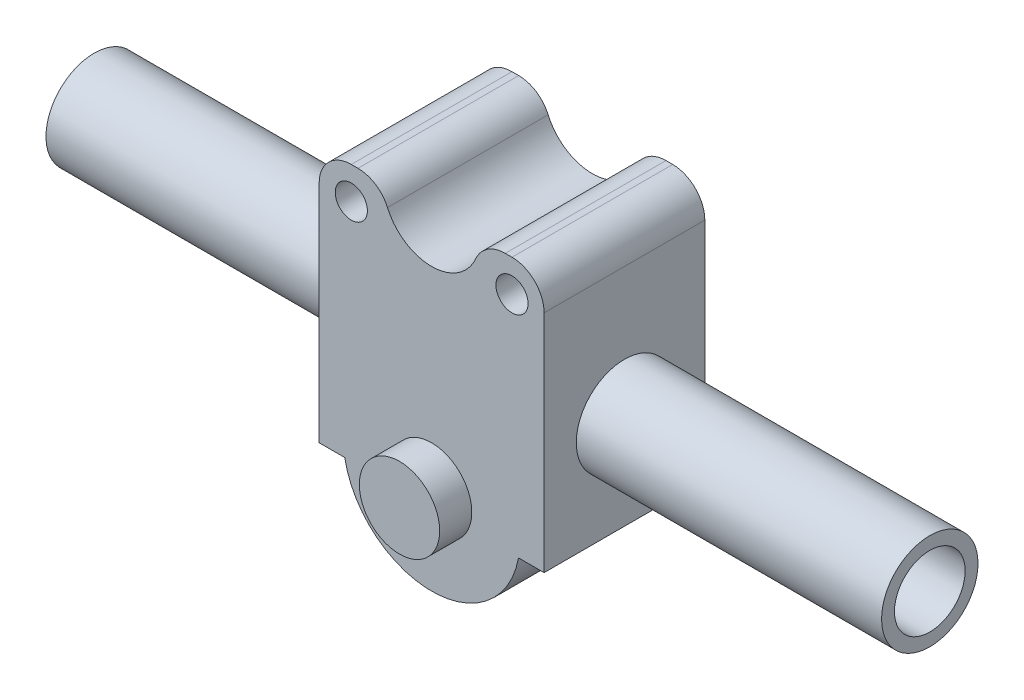
ISO-10303-21;
HEADER;
FILE_DESCRIPTION(('STEP AP214'),'2;1');
FILE_NAME('part.step','',(''),(''),'','','');
FILE_SCHEMA(('AUTOMOTIVE_DESIGN { 1 0 10303 214 1 1 1 1 }'));
ENDSEC;
DATA;
#1=APPLICATION_CONTEXT('core data for automotive mechanical design processes');
#2=APPLICATION_PROTOCOL_DEFINITION('international standard','automotive_design',2000,#1);
#3=PRODUCT_CONTEXT('',#1,'mechanical');
#4=PRODUCT('Part','Part','',(#3));
#5=PRODUCT_RELATED_PRODUCT_CATEGORY('part','',(#4));
#6=PRODUCT_DEFINITION_FORMATION('','',#4);
#7=PRODUCT_DEFINITION_CONTEXT('part definition',#1,'design');
#8=PRODUCT_DEFINITION('design','',#6,#7);
#9=PRODUCT_DEFINITION_SHAPE('','',#8);
#10=(LENGTH_UNIT() NAMED_UNIT(*) SI_UNIT(.MILLI.,.METRE.));
#11=(NAMED_UNIT(*) PLANE_ANGLE_UNIT() SI_UNIT($,.RADIAN.));
#12=(NAMED_UNIT(*) SI_UNIT($,.STERADIAN.) SOLID_ANGLE_UNIT());
#13=UNCERTAINTY_MEASURE_WITH_UNIT(LENGTH_MEASURE(1.E-05),#10,'distance_accuracy_value','');
#14=(GEOMETRIC_REPRESENTATION_CONTEXT(3) GLOBAL_UNCERTAINTY_ASSIGNED_CONTEXT((#13)) GLOBAL_UNIT_ASSIGNED_CONTEXT((#10,
#11,#12)) REPRESENTATION_CONTEXT('',''));
#15=CARTESIAN_POINT('',(0.,0.,0.));
#16=DIRECTION('',(0.,0.,1.));
#17=DIRECTION('',(1.,0.,0.));
#18=AXIS2_PLACEMENT_3D('',#15,#16,#17);
#19=CARTESIAN_POINT('',(0.,0.,55.));
#20=DIRECTION('',(0.,0.,-1.));
#21=DIRECTION('',(-1.,0.,0.));
#22=AXIS2_PLACEMENT_3D('',#19,#20,#21);
#23=CYLINDRICAL_SURFACE('',#22,6.);
#24=CARTESIAN_POINT('',(0.,0.,12.));
#25=DIRECTION('',(0.,0.,1.));
#26=DIRECTION('',(1.,0.,0.));
#27=AXIS2_PLACEMENT_3D('',#24,#25,#26);
#28=CIRCLE('',#27,6.);
#29=CARTESIAN_POINT('',(6.,0.,12.));
#30=VERTEX_POINT('',#29);
#31=EDGE_CURVE('E805',#30,#30,#28,.T.);
#32=ORIENTED_EDGE('',*,*,#31,.F.);
#33=EDGE_LOOP('',(#32));
#34=FACE_BOUND('',#33,.T.);
#35=CARTESIAN_POINT('',(0.,0.,50.));
#36=DIRECTION('',(0.,0.,1.));
#37=DIRECTION('',(1.,0.,0.));
#38=AXIS2_PLACEMENT_3D('',#35,#36,#37);
#39=CIRCLE('',#38,6.);
#40=CARTESIAN_POINT('',(6.,0.,50.));
#41=VERTEX_POINT('',#40);
#42=EDGE_CURVE('E43',#41,#41,#39,.T.);
#43=ORIENTED_EDGE('',*,*,#42,.T.);
#44=EDGE_LOOP('',(#43));
#45=FACE_BOUND('',#44,.T.);
#46=ADVANCED_FACE('F39',(#34,#45),#23,.F.);
#47=CARTESIAN_POINT('',(25.,65.,45.));
#48=DIRECTION('',(0.,0.,-1.));
#49=DIRECTION('',(-1.,0.,0.));
#50=AXIS2_PLACEMENT_3D('',#47,#48,#49);
#51=PLANE('',#50);
#52=CARTESIAN_POINT('',(0.,0.,45.));
#53=DIRECTION('',(0.,0.,-1.));
#54=DIRECTION('',(-1.,0.,0.));
#55=AXIS2_PLACEMENT_3D('',#52,#53,#54);
#56=CIRCLE('',#55,12.5);
#57=CARTESIAN_POINT('',(-12.5,0.,45.));
#58=VERTEX_POINT('',#57);
#59=EDGE_CURVE('E11',#58,#58,#56,.T.);
#60=ORIENTED_EDGE('',*,*,#59,.F.);
#61=EDGE_LOOP('',(#60));
#62=FACE_BOUND('',#61,.T.);
#63=CARTESIAN_POINT('',(0.,75.,45.));
#64=DIRECTION('',(0.,0.,-1.));
#65=DIRECTION('',(-1.,0.,0.));
#66=AXIS2_PLACEMENT_3D('',#63,#64,#65);
#67=CIRCLE('',#66,20.);
#68=CARTESIAN_POINT('',(15.3915936973581,62.2289842433953,45.));
#69=VERTEX_POINT('',#68);
#70=CARTESIAN_POINT('',(-15.3915936973581,62.2289842433953,45.));
#71=VERTEX_POINT('',#70);
#72=EDGE_CURVE('E304',#69,#71,#67,.T.);
#73=ORIENTED_EDGE('',*,*,#72,.F.);
#74=CARTESIAN_POINT('',(25.,65.,45.));
#75=DIRECTION('',(0.,0.,-1.));
#76=DIRECTION('',(-1.,0.,0.));
#77=AXIS2_PLACEMENT_3D('',#74,#75,#76);
#78=CIRCLE('',#77,10.);
#79=CARTESIAN_POINT('',(30.,56.3397459621556,45.));
#80=VERTEX_POINT('',#79);
#81=EDGE_CURVE('E314',#69,#80,#78,.F.);
#82=ORIENTED_EDGE('',*,*,#81,.T.);
#83=DIRECTION('',(0.,1.,0.));
#84=VECTOR('',#83,1.);
#85=CARTESIAN_POINT('',(30.,65.,45.));
#86=LINE('',#85,#84);
#87=CARTESIAN_POINT('',(30.,0.,45.));
#88=VERTEX_POINT('',#87);
#89=EDGE_CURVE('E366',#88,#80,#86,.T.);
#90=ORIENTED_EDGE('',*,*,#89,.F.);
#91=DIRECTION('',(1.,0.,0.));
#92=VECTOR('',#91,1.);
#93=CARTESIAN_POINT('',(25.,0.,45.));
#94=LINE('',#93,#92);
#95=CARTESIAN_POINT('',(22.5,0.,45.));
#96=VERTEX_POINT('',#95);
#97=EDGE_CURVE('E370',#96,#88,#94,.T.);
#98=ORIENTED_EDGE('',*,*,#97,.F.);
#99=CARTESIAN_POINT('',(0.,0.,45.));
#100=DIRECTION('',(0.,0.,-1.));
#101=DIRECTION('',(-1.,0.,0.));
#102=AXIS2_PLACEMENT_3D('',#99,#100,#101);
#103=CIRCLE('',#102,22.5);
#104=CARTESIAN_POINT('',(-22.5,0.,45.));
#105=VERTEX_POINT('',#104);
#106=EDGE_CURVE('E374',#105,#96,#103,.F.);
#107=ORIENTED_EDGE('',*,*,#106,.F.);
#108=DIRECTION('',(1.,0.,0.));
#109=VECTOR('',#108,1.);
#110=CARTESIAN_POINT('',(25.,0.,45.));
#111=LINE('',#110,#109);
#112=CARTESIAN_POINT('',(-30.,0.,45.));
#113=VERTEX_POINT('',#112);
#114=EDGE_CURVE('E107',#113,#105,#111,.T.);
#115=ORIENTED_EDGE('',*,*,#114,.F.);
#116=DIRECTION('',(0.,-1.,0.));
#117=VECTOR('',#116,1.);
#118=CARTESIAN_POINT('',(-30.,65.,45.));
#119=LINE('',#118,#117);
#120=CARTESIAN_POINT('',(-30.,56.3397459621556,45.));
#121=VERTEX_POINT('',#120);
#122=EDGE_CURVE('E114',#121,#113,#119,.T.);
#123=ORIENTED_EDGE('',*,*,#122,.F.);
#124=CARTESIAN_POINT('',(-25.,65.,45.));
#125=DIRECTION('',(0.,0.,-1.));
#126=DIRECTION('',(-1.,0.,0.));
#127=AXIS2_PLACEMENT_3D('',#124,#125,#126);
#128=CIRCLE('',#127,10.);
#129=EDGE_CURVE('E307',#121,#71,#128,.F.);
#130=ORIENTED_EDGE('',*,*,#129,.T.);
#131=EDGE_LOOP('',(#73,#82,#90,#98,#107,#115,#123,#130));
#132=FACE_BOUND('',#131,.T.);
#133=ADVANCED_FACE('F412',(#62,#132),#51,.T.);
#134=CARTESIAN_POINT('',(25.,65.,5.));
#135=DIRECTION('',(0.,0.,-1.));
#136=DIRECTION('',(-1.,0.,0.));
#137=AXIS2_PLACEMENT_3D('',#134,#135,#136);
#138=PLANE('',#137);
#139=CARTESIAN_POINT('',(0.,0.,5.));
#140=DIRECTION('',(0.,0.,-1.));
#141=DIRECTION('',(-1.,0.,0.));
#142=AXIS2_PLACEMENT_3D('',#139,#140,#141);
#143=CIRCLE('',#142,15.);
#144=CARTESIAN_POINT('',(-15.,0.,5.));
#145=VERTEX_POINT('',#144);
#146=EDGE_CURVE('E857',#145,#145,#143,.T.);
#147=ORIENTED_EDGE('',*,*,#146,.T.);
#148=EDGE_LOOP('',(#147));
#149=FACE_BOUND('',#148,.T.);
#150=CARTESIAN_POINT('',(-25.,65.,5.));
#151=DIRECTION('',(0.,0.,-1.));
#152=DIRECTION('',(-1.,0.,0.));
#153=AXIS2_PLACEMENT_3D('',#150,#151,#152);
#154=CIRCLE('',#153,10.);
#155=CARTESIAN_POINT('',(-30.,56.3397459621556,5.));
#156=VERTEX_POINT('',#155);
#157=CARTESIAN_POINT('',(-15.3915936973581,62.2289842433953,5.));
#158=VERTEX_POINT('',#157);
#159=EDGE_CURVE('E362',#156,#158,#154,.F.);
#160=ORIENTED_EDGE('',*,*,#159,.F.);
#161=DIRECTION('',(0.,-1.,0.));
#162=VECTOR('',#161,1.);
#163=CARTESIAN_POINT('',(-30.,65.,5.));
#164=LINE('',#163,#162);
#165=CARTESIAN_POINT('',(-30.,0.,5.));
#166=VERTEX_POINT('',#165);
#167=EDGE_CURVE('E330',#156,#166,#164,.T.);
#168=ORIENTED_EDGE('',*,*,#167,.T.);
#169=DIRECTION('',(1.,0.,0.));
#170=VECTOR('',#169,1.);
#171=CARTESIAN_POINT('',(25.,0.,5.));
#172=LINE('',#171,#170);
#173=CARTESIAN_POINT('',(-22.5,0.,5.));
#174=VERTEX_POINT('',#173);
#175=EDGE_CURVE('E327',#166,#174,#172,.T.);
#176=ORIENTED_EDGE('',*,*,#175,.T.);
#177=CARTESIAN_POINT('',(0.,0.,5.));
#178=DIRECTION('',(0.,0.,-1.));
#179=DIRECTION('',(-1.,0.,0.));
#180=AXIS2_PLACEMENT_3D('',#177,#178,#179);
#181=CIRCLE('',#180,22.5);
#182=CARTESIAN_POINT('',(22.5,0.,5.));
#183=VERTEX_POINT('',#182);
#184=EDGE_CURVE('E321',#174,#183,#181,.F.);
#185=ORIENTED_EDGE('',*,*,#184,.T.);
#186=DIRECTION('',(1.,0.,0.));
#187=VECTOR('',#186,1.);
#188=CARTESIAN_POINT('',(25.,0.,5.));
#189=LINE('',#188,#187);
#190=CARTESIAN_POINT('',(30.,0.,5.));
#191=VERTEX_POINT('',#190);
#192=EDGE_CURVE('E354',#183,#191,#189,.T.);
#193=ORIENTED_EDGE('',*,*,#192,.T.);
#194=DIRECTION('',(0.,1.,0.));
#195=VECTOR('',#194,1.);
#196=CARTESIAN_POINT('',(30.,65.,5.));
#197=LINE('',#196,#195);
#198=CARTESIAN_POINT('',(30.,56.3397459621556,5.));
#199=VERTEX_POINT('',#198);
#200=EDGE_CURVE('E342',#191,#199,#197,.T.);
#201=ORIENTED_EDGE('',*,*,#200,.T.);
#202=CARTESIAN_POINT('',(25.,65.,5.));
#203=DIRECTION('',(0.,0.,-1.));
#204=DIRECTION('',(-1.,0.,0.));
#205=AXIS2_PLACEMENT_3D('',#202,#203,#204);
#206=CIRCLE('',#205,10.);
#207=CARTESIAN_POINT('',(15.3915936973581,62.2289842433953,5.));
#208=VERTEX_POINT('',#207);
#209=EDGE_CURVE('E358',#208,#199,#206,.F.);
#210=ORIENTED_EDGE('',*,*,#209,.F.);
#211=CARTESIAN_POINT('',(0.,75.,5.));
#212=DIRECTION('',(0.,0.,-1.));
#213=DIRECTION('',(-1.,0.,0.));
#214=AXIS2_PLACEMENT_3D('',#211,#212,#213);
#215=CIRCLE('',#214,20.);
#216=EDGE_CURVE('E336',#208,#158,#215,.T.);
#217=ORIENTED_EDGE('',*,*,#216,.T.);
#218=EDGE_LOOP('',(#160,#168,#176,#185,#193,#201,#210,#217));
#219=FACE_BOUND('',#218,.T.);
#220=ADVANCED_FACE('F419',(#149,#219),#138,.F.);
#221=CARTESIAN_POINT('',(27.0416345659799,0.,50.));
#222=DIRECTION('',(0.,1.,0.));
#223=DIRECTION('',(0.,0.,1.));
#224=AXIS2_PLACEMENT_3D('',#221,#222,#223);
#225=PLANE('',#224);
#226=ORIENTED_EDGE('',*,*,#192,.F.);
#227=DIRECTION('',(0.,0.,-1.));
#228=VECTOR('',#227,1.);
#229=CARTESIAN_POINT('',(22.5,0.,45.));
#230=LINE('',#229,#228);
#231=EDGE_CURVE('E350',#96,#183,#230,.T.);
#232=ORIENTED_EDGE('',*,*,#231,.F.);
#233=ORIENTED_EDGE('',*,*,#97,.T.);
#234=DIRECTION('',(0.,0.,-1.));
#235=VECTOR('',#234,1.);
#236=CARTESIAN_POINT('',(30.,0.,50.));
#237=LINE('',#236,#235);
#238=EDGE_CURVE('E346',#88,#191,#237,.T.);
#239=ORIENTED_EDGE('',*,*,#238,.T.);
#240=EDGE_LOOP('',(#226,#232,#233,#239));
#241=FACE_BOUND('',#240,.T.);
#242=ADVANCED_FACE('F571',(#241),#225,.T.);
#243=CARTESIAN_POINT('',(30.,64.9999999999999,50.));
#244=DIRECTION('',(-1.,0.,0.));
#245=DIRECTION('',(0.,-1.,0.));
#246=AXIS2_PLACEMENT_3D('',#243,#244,#245);
#247=PLANE('',#246);
#248=CARTESIAN_POINT('',(30.,25.,25.));
#249=DIRECTION('',(-1.,0.,0.));
#250=DIRECTION('',(0.,-1.,0.));
#251=AXIS2_PLACEMENT_3D('',#248,#249,#250);
#252=CIRCLE('',#251,11.);
#253=CARTESIAN_POINT('',(30.,14.,25.));
#254=VERTEX_POINT('',#253);
#255=EDGE_CURVE('E830',#254,#254,#252,.T.);
#256=ORIENTED_EDGE('',*,*,#255,.F.);
#257=EDGE_LOOP('',(#256));
#258=FACE_BOUND('',#257,.T.);
#259=DIRECTION('',(0.,0.,-1.));
#260=VECTOR('',#259,1.);
#261=CARTESIAN_POINT('',(30.,56.3397459621556,50.));
#262=LINE('',#261,#260);
#263=EDGE_CURVE('E311',#80,#199,#262,.T.);
#264=ORIENTED_EDGE('',*,*,#263,.T.);
#265=ORIENTED_EDGE('',*,*,#200,.F.);
#266=ORIENTED_EDGE('',*,*,#238,.F.);
#267=ORIENTED_EDGE('',*,*,#89,.T.);
#268=EDGE_LOOP('',(#264,#265,#266,#267));
#269=FACE_BOUND('',#268,.T.);
#270=ADVANCED_FACE('F575',(#258,#269),#247,.T.);
#271=CARTESIAN_POINT('',(0.,75.,50.));
#272=DIRECTION('',(0.,0.,-1.));
#273=DIRECTION('',(-1.,0.,0.));
#274=AXIS2_PLACEMENT_3D('',#271,#272,#273);
#275=CYLINDRICAL_SURFACE('',#274,20.);
#276=ORIENTED_EDGE('',*,*,#72,.T.);
#277=DIRECTION('',(0.,0.,1.));
#278=VECTOR('',#277,1.);
#279=CARTESIAN_POINT('',(-15.3915936973581,62.2289842433953,50.));
#280=LINE('',#279,#278);
#281=EDGE_CURVE('E59',#71,#158,#280,.F.);
#282=ORIENTED_EDGE('',*,*,#281,.T.);
#283=ORIENTED_EDGE('',*,*,#216,.F.);
#284=DIRECTION('',(0.,0.,1.));
#285=VECTOR('',#284,1.);
#286=CARTESIAN_POINT('',(15.3915936973581,62.2289842433953,50.));
#287=LINE('',#286,#285);
#288=EDGE_CURVE('E339',#69,#208,#287,.F.);
#289=ORIENTED_EDGE('',*,*,#288,.F.);
#290=EDGE_LOOP('',(#276,#282,#283,#289));
#291=FACE_BOUND('',#290,.T.);
#292=ADVANCED_FACE('F579',(#291),#275,.T.);
#293=CARTESIAN_POINT('',(-30.,64.9999999999999,50.));
#294=DIRECTION('',(1.,0.,0.));
#295=DIRECTION('',(0.,1.,0.));
#296=AXIS2_PLACEMENT_3D('',#293,#294,#295);
#297=PLANE('',#296);
#298=CARTESIAN_POINT('',(-30.,25.,25.));
#299=DIRECTION('',(1.,0.,0.));
#300=DIRECTION('',(0.,1.,0.));
#301=AXIS2_PLACEMENT_3D('',#298,#299,#300);
#302=CIRCLE('',#301,11.);
#303=CARTESIAN_POINT('',(-30.,36.,25.));
#304=VERTEX_POINT('',#303);
#305=EDGE_CURVE('E823',#304,#304,#302,.T.);
#306=ORIENTED_EDGE('',*,*,#305,.F.);
#307=EDGE_LOOP('',(#306));
#308=FACE_BOUND('',#307,.T.);
#309=ORIENTED_EDGE('',*,*,#122,.T.);
#310=DIRECTION('',(0.,0.,-1.));
#311=VECTOR('',#310,1.);
#312=CARTESIAN_POINT('',(-30.,0.,50.));
#313=LINE('',#312,#311);
#314=EDGE_CURVE('E324',#113,#166,#313,.T.);
#315=ORIENTED_EDGE('',*,*,#314,.T.);
#316=ORIENTED_EDGE('',*,*,#167,.F.);
#317=DIRECTION('',(0.,0.,-1.));
#318=VECTOR('',#317,1.);
#319=CARTESIAN_POINT('',(-30.,56.3397459621556,50.));
#320=LINE('',#319,#318);
#321=EDGE_CURVE('E333',#121,#156,#320,.T.);
#322=ORIENTED_EDGE('',*,*,#321,.F.);
#323=EDGE_LOOP('',(#309,#315,#316,#322));
#324=FACE_BOUND('',#323,.T.);
#325=ADVANCED_FACE('F583',(#308,#324),#297,.T.);
#326=CARTESIAN_POINT('',(-35.,0.,50.));
#327=DIRECTION('',(0.,1.,0.));
#328=DIRECTION('',(0.,0.,1.));
#329=AXIS2_PLACEMENT_3D('',#326,#327,#328);
#330=PLANE('',#329);
#331=ORIENTED_EDGE('',*,*,#175,.F.);
#332=ORIENTED_EDGE('',*,*,#314,.F.);
#333=ORIENTED_EDGE('',*,*,#114,.T.);
#334=DIRECTION('',(0.,0.,-1.));
#335=VECTOR('',#334,1.);
#336=CARTESIAN_POINT('',(-22.5,0.,45.));
#337=LINE('',#336,#335);
#338=EDGE_CURVE('E318',#105,#174,#337,.T.);
#339=ORIENTED_EDGE('',*,*,#338,.T.);
#340=EDGE_LOOP('',(#331,#332,#333,#339));
#341=FACE_BOUND('',#340,.T.);
#342=ADVANCED_FACE('F586',(#341),#330,.T.);
#343=CARTESIAN_POINT('',(0.,0.,50.));
#344=DIRECTION('',(0.,0.,-1.));
#345=DIRECTION('',(-1.,0.,0.));
#346=AXIS2_PLACEMENT_3D('',#343,#344,#345);
#347=CYLINDRICAL_SURFACE('',#346,22.5);
#348=ORIENTED_EDGE('',*,*,#184,.F.);
#349=ORIENTED_EDGE('',*,*,#338,.F.);
#350=ORIENTED_EDGE('',*,*,#106,.T.);
#351=ORIENTED_EDGE('',*,*,#231,.T.);
#352=EDGE_LOOP('',(#348,#349,#350,#351));
#353=FACE_BOUND('',#352,.T.);
#354=ADVANCED_FACE('F590',(#353),#347,.F.);
#355=CARTESIAN_POINT('',(25.,65.,50.));
#356=DIRECTION('',(0.,0.,-1.));
#357=DIRECTION('',(-1.,0.,0.));
#358=AXIS2_PLACEMENT_3D('',#355,#356,#357);
#359=CYLINDRICAL_SURFACE('',#358,10.);
#360=ORIENTED_EDGE('',*,*,#81,.F.);
#361=ORIENTED_EDGE('',*,*,#288,.T.);
#362=ORIENTED_EDGE('',*,*,#209,.T.);
#363=ORIENTED_EDGE('',*,*,#263,.F.);
#364=EDGE_LOOP('',(#360,#361,#362,#363));
#365=FACE_BOUND('',#364,.T.);
#366=ADVANCED_FACE('F592',(#365),#359,.T.);
#367=CARTESIAN_POINT('',(-25.,65.,50.));
#368=DIRECTION('',(0.,0.,-1.));
#369=DIRECTION('',(-1.,0.,0.));
#370=AXIS2_PLACEMENT_3D('',#367,#368,#369);
#371=CYLINDRICAL_SURFACE('',#370,10.);
#372=ORIENTED_EDGE('',*,*,#321,.T.);
#373=ORIENTED_EDGE('',*,*,#159,.T.);
#374=ORIENTED_EDGE('',*,*,#281,.F.);
#375=ORIENTED_EDGE('',*,*,#129,.F.);
#376=EDGE_LOOP('',(#372,#373,#374,#375));
#377=FACE_BOUND('',#376,.T.);
#378=ADVANCED_FACE('F41',(#377),#371,.T.);
#379=CARTESIAN_POINT('',(0.,0.,5.));
#380=DIRECTION('',(0.,0.,-1.));
#381=DIRECTION('',(-1.,0.,0.));
#382=AXIS2_PLACEMENT_3D('',#379,#380,#381);
#383=CYLINDRICAL_SURFACE('',#382,15.);
#384=ORIENTED_EDGE('',*,*,#146,.F.);
#385=EDGE_LOOP('',(#384));
#386=FACE_BOUND('',#385,.T.);
#387=CARTESIAN_POINT('',(0.,0.,0.));
#388=DIRECTION('',(0.,0.,-1.));
#389=DIRECTION('',(-1.,0.,0.));
#390=AXIS2_PLACEMENT_3D('',#387,#388,#389);
#391=CIRCLE('',#390,15.);
#392=CARTESIAN_POINT('',(-15.,0.,0.));
#393=VERTEX_POINT('',#392);
#394=EDGE_CURVE('E854',#393,#393,#391,.T.);
#395=ORIENTED_EDGE('',*,*,#394,.T.);
#396=EDGE_LOOP('',(#395));
#397=FACE_BOUND('',#396,.T.);
#398=ADVANCED_FACE('F456',(#386,#397),#383,.F.);
#399=CARTESIAN_POINT('',(0.,0.,-10.));
#400=DIRECTION('',(0.,0.,-1.));
#401=DIRECTION('',(-1.,0.,0.));
#402=AXIS2_PLACEMENT_3D('',#399,#400,#401);
#403=PLANE('',#402);
#404=CARTESIAN_POINT('',(0.,0.,-10.));
#405=DIRECTION('',(0.,0.,-1.));
#406=DIRECTION('',(-1.,0.,0.));
#407=AXIS2_PLACEMENT_3D('',#404,#405,#406);
#408=CIRCLE('',#407,27.5);
#409=CARTESIAN_POINT('',(-27.5,0.,-10.));
#410=VERTEX_POINT('',#409);
#411=EDGE_CURVE('E847',#410,#410,#408,.T.);
#412=ORIENTED_EDGE('',*,*,#411,.T.);
#413=EDGE_LOOP('',(#412));
#414=FACE_BOUND('',#413,.T.);
#415=CARTESIAN_POINT('',(0.,0.,-10.));
#416=DIRECTION('',(0.,0.,-1.));
#417=DIRECTION('',(-1.,0.,0.));
#418=AXIS2_PLACEMENT_3D('',#415,#416,#417);
#419=CIRCLE('',#418,6.);
#420=CARTESIAN_POINT('',(-6.,0.,-10.));
#421=VERTEX_POINT('',#420);
#422=EDGE_CURVE('E843',#421,#421,#419,.T.);
#423=ORIENTED_EDGE('',*,*,#422,.F.);
#424=EDGE_LOOP('',(#423));
#425=FACE_BOUND('',#424,.T.);
#426=ADVANCED_FACE('F453',(#414,#425),#403,.T.);
#427=CARTESIAN_POINT('',(0.,0.,0.));
#428=DIRECTION('',(0.,0.,-1.));
#429=DIRECTION('',(-1.,0.,0.));
#430=AXIS2_PLACEMENT_3D('',#427,#428,#429);
#431=PLANE('',#430);
#432=ORIENTED_EDGE('',*,*,#394,.F.);
#433=EDGE_LOOP('',(#432));
#434=FACE_BOUND('',#433,.T.);
#435=CARTESIAN_POINT('',(0.,0.,0.));
#436=DIRECTION('',(0.,0.,-1.));
#437=DIRECTION('',(-1.,0.,0.));
#438=AXIS2_PLACEMENT_3D('',#435,#436,#437);
#439=CIRCLE('',#438,6.);
#440=CARTESIAN_POINT('',(-6.,0.,0.));
#441=VERTEX_POINT('',#440);
#442=EDGE_CURVE('E842',#441,#441,#439,.T.);
#443=ORIENTED_EDGE('',*,*,#442,.T.);
#444=EDGE_LOOP('',(#443));
#445=FACE_BOUND('',#444,.T.);
#446=ADVANCED_FACE('F406',(#434,#445),#431,.F.);
#447=CARTESIAN_POINT('',(0.,0.,-10.));
#448=DIRECTION('',(0.,0.,1.));
#449=DIRECTION('',(1.,0.,0.));
#450=AXIS2_PLACEMENT_3D('',#447,#448,#449);
#451=CYLINDRICAL_SURFACE('',#450,6.);
#452=ORIENTED_EDGE('',*,*,#422,.T.);
#453=EDGE_LOOP('',(#452));
#454=FACE_BOUND('',#453,.T.);
#455=ORIENTED_EDGE('',*,*,#442,.F.);
#456=EDGE_LOOP('',(#455));
#457=FACE_BOUND('',#456,.T.);
#458=ADVANCED_FACE('F395',(#454,#457),#451,.F.);
#459=CARTESIAN_POINT('',(25.,65.,50.));
#460=DIRECTION('',(0.,0.,-1.));
#461=DIRECTION('',(-1.,0.,0.));
#462=AXIS2_PLACEMENT_3D('',#459,#460,#461);
#463=PLANE('',#462);
#464=CARTESIAN_POINT('',(0.,0.,50.));
#465=DIRECTION('',(0.,0.,-1.));
#466=DIRECTION('',(-1.,0.,0.));
#467=AXIS2_PLACEMENT_3D('',#464,#465,#466);
#468=CIRCLE('',#467,12.5);
#469=CARTESIAN_POINT('',(-12.5,0.,50.));
#470=VERTEX_POINT('',#469);
#471=EDGE_CURVE('E50',#470,#470,#468,.F.);
#472=ORIENTED_EDGE('',*,*,#471,.F.);
#473=EDGE_LOOP('',(#472));
#474=FACE_BOUND('',#473,.T.);
#475=DIRECTION('',(1.,0.,0.));
#476=VECTOR('',#475,1.);
#477=CARTESIAN_POINT('',(27.0416345659799,-5.,50.));
#478=LINE('',#477,#476);
#479=CARTESIAN_POINT('',(27.0416345659799,-5.,50.));
#480=VERTEX_POINT('',#479);
#481=CARTESIAN_POINT('',(35.,-5.,50.));
#482=VERTEX_POINT('',#481);
#483=EDGE_CURVE('E265',#480,#482,#478,.T.);
#484=ORIENTED_EDGE('',*,*,#483,.T.);
#485=DIRECTION('',(0.,1.,0.));
#486=VECTOR('',#485,1.);
#487=CARTESIAN_POINT('',(35.,64.9999999999999,50.));
#488=LINE('',#487,#486);
#489=CARTESIAN_POINT('',(35.,64.9999999999999,50.));
#490=VERTEX_POINT('',#489);
#491=EDGE_CURVE('E178',#482,#490,#488,.T.);
#492=ORIENTED_EDGE('',*,*,#491,.T.);
#493=CARTESIAN_POINT('',(25.,65.,50.));
#494=DIRECTION('',(0.,0.,1.));
#495=DIRECTION('',(-1.,0.,0.));
#496=AXIS2_PLACEMENT_3D('',#493,#494,#495);
#497=CIRCLE('',#496,10.);
#498=CARTESIAN_POINT('',(24.9999999999999,75.,50.));
#499=VERTEX_POINT('',#498);
#500=EDGE_CURVE('E494',#490,#499,#497,.T.);
#501=ORIENTED_EDGE('',*,*,#500,.T.);
#502=DIRECTION('',(-1.,0.,0.));
#503=VECTOR('',#502,1.);
#504=CARTESIAN_POINT('',(22.9128784747792,75.,50.));
#505=LINE('',#504,#503);
#506=CARTESIAN_POINT('',(22.9128784747792,75.,50.));
#507=VERTEX_POINT('',#506);
#508=EDGE_CURVE('E497',#499,#507,#505,.T.);
#509=ORIENTED_EDGE('',*,*,#508,.T.);
#510=CARTESIAN_POINT('',(22.9128784747792,65.,50.));
#511=DIRECTION('',(0.,0.,1.));
#512=DIRECTION('',(-1.,0.,0.));
#513=AXIS2_PLACEMENT_3D('',#510,#511,#512);
#514=CIRCLE('',#513,10.);
#515=CARTESIAN_POINT('',(13.7477270848675,69.,50.));
#516=VERTEX_POINT('',#515);
#517=EDGE_CURVE('E500',#507,#516,#514,.T.);
#518=ORIENTED_EDGE('',*,*,#517,.T.);
#519=CARTESIAN_POINT('',(0.,75.,50.));
#520=DIRECTION('',(0.,0.,-1.));
#521=DIRECTION('',(1.,0.,0.));
#522=AXIS2_PLACEMENT_3D('',#519,#520,#521);
#523=CIRCLE('',#522,15.);
#524=CARTESIAN_POINT('',(-13.7477270848675,69.,50.));
#525=VERTEX_POINT('',#524);
#526=EDGE_CURVE('E503',#516,#525,#523,.T.);
#527=ORIENTED_EDGE('',*,*,#526,.T.);
#528=CARTESIAN_POINT('',(-22.9128784747792,65.,50.));
#529=DIRECTION('',(0.,0.,1.));
#530=DIRECTION('',(1.,0.,0.));
#531=AXIS2_PLACEMENT_3D('',#528,#529,#530);
#532=CIRCLE('',#531,10.);
#533=CARTESIAN_POINT('',(-22.9128784747792,75.,50.));
#534=VERTEX_POINT('',#533);
#535=EDGE_CURVE('E506',#525,#534,#532,.T.);
#536=ORIENTED_EDGE('',*,*,#535,.T.);
#537=DIRECTION('',(-1.,0.,0.));
#538=VECTOR('',#537,1.);
#539=CARTESIAN_POINT('',(-24.9999999999999,75.,50.));
#540=LINE('',#539,#538);
#541=CARTESIAN_POINT('',(-24.9999999999999,75.,50.));
#542=VERTEX_POINT('',#541);
#543=EDGE_CURVE('E509',#534,#542,#540,.T.);
#544=ORIENTED_EDGE('',*,*,#543,.T.);
#545=CARTESIAN_POINT('',(-25.,65.,50.));
#546=DIRECTION('',(0.,0.,1.));
#547=DIRECTION('',(1.,0.,0.));
#548=AXIS2_PLACEMENT_3D('',#545,#546,#547);
#549=CIRCLE('',#548,10.);
#550=CARTESIAN_POINT('',(-35.,64.9999999999999,50.));
#551=VERTEX_POINT('',#550);
#552=EDGE_CURVE('E211',#542,#551,#549,.T.);
#553=ORIENTED_EDGE('',*,*,#552,.T.);
#554=DIRECTION('',(0.,-1.,0.));
#555=VECTOR('',#554,1.);
#556=CARTESIAN_POINT('',(-35.,64.9999999999999,50.));
#557=LINE('',#556,#555);
#558=CARTESIAN_POINT('',(-35.,-5.,50.));
#559=VERTEX_POINT('',#558);
#560=EDGE_CURVE('E204',#551,#559,#557,.T.);
#561=ORIENTED_EDGE('',*,*,#560,.T.);
#562=DIRECTION('',(1.,0.,0.));
#563=VECTOR('',#562,1.);
#564=CARTESIAN_POINT('',(-35.,-5.,50.));
#565=LINE('',#564,#563);
#566=CARTESIAN_POINT('',(-27.0416345659799,-5.,50.));
#567=VERTEX_POINT('',#566);
#568=EDGE_CURVE('E208',#559,#567,#565,.T.);
#569=ORIENTED_EDGE('',*,*,#568,.T.);
#570=CARTESIAN_POINT('',(0.,0.,50.));
#571=DIRECTION('',(0.,0.,1.));
#572=DIRECTION('',(1.,0.,0.));
#573=AXIS2_PLACEMENT_3D('',#570,#571,#572);
#574=CIRCLE('',#573,27.5);
#575=EDGE_CURVE('E122',#567,#480,#574,.T.);
#576=ORIENTED_EDGE('',*,*,#575,.T.);
#577=EDGE_LOOP('',(#484,#492,#501,#509,#518,#527,#536,#544,#553,#561,#569,#576));
#578=FACE_BOUND('',#577,.T.);
#579=CARTESIAN_POINT('',(25.,65.,50.));
#580=DIRECTION('',(0.,0.,1.));
#581=DIRECTION('',(1.,0.,0.));
#582=AXIS2_PLACEMENT_3D('',#579,#580,#581);
#583=CIRCLE('',#582,5.);
#584=CARTESIAN_POINT('',(30.,65.,50.));
#585=VERTEX_POINT('',#584);
#586=EDGE_CURVE('E236',#585,#585,#583,.T.);
#587=ORIENTED_EDGE('',*,*,#586,.F.);
#588=EDGE_LOOP('',(#587));
#589=FACE_BOUND('',#588,.T.);
#590=CARTESIAN_POINT('',(-25.,65.,50.));
#591=DIRECTION('',(0.,0.,1.));
#592=DIRECTION('',(1.,0.,0.));
#593=AXIS2_PLACEMENT_3D('',#590,#591,#592);
#594=CIRCLE('',#593,5.);
#595=CARTESIAN_POINT('',(-20.,65.,50.));
#596=VERTEX_POINT('',#595);
#597=EDGE_CURVE('E480',#596,#596,#594,.T.);
#598=ORIENTED_EDGE('',*,*,#597,.F.);
#599=EDGE_LOOP('',(#598));
#600=FACE_BOUND('',#599,.T.);
#601=ADVANCED_FACE('F205',(#474,#578,#589,#600),#463,.F.);
#602=CARTESIAN_POINT('',(-25.,65.,50.));
#603=DIRECTION('',(0.,0.,-1.));
#604=DIRECTION('',(-1.,0.,0.));
#605=AXIS2_PLACEMENT_3D('',#602,#603,#604);
#606=CYLINDRICAL_SURFACE('',#605,5.);
#607=ORIENTED_EDGE('',*,*,#597,.T.);
#608=EDGE_LOOP('',(#607));
#609=FACE_BOUND('',#608,.T.);
#610=CARTESIAN_POINT('',(-25.,65.,0.));
#611=DIRECTION('',(0.,0.,1.));
#612=DIRECTION('',(1.,0.,0.));
#613=AXIS2_PLACEMENT_3D('',#610,#611,#612);
#614=CIRCLE('',#613,5.);
#615=CARTESIAN_POINT('',(-20.,65.,0.));
#616=VERTEX_POINT('',#615);
#617=EDGE_CURVE('E486',#616,#616,#614,.T.);
#618=ORIENTED_EDGE('',*,*,#617,.F.);
#619=EDGE_LOOP('',(#618));
#620=FACE_BOUND('',#619,.T.);
#621=ADVANCED_FACE('F394',(#609,#620),#606,.F.);
#622=CARTESIAN_POINT('',(25.,65.,50.));
#623=DIRECTION('',(0.,0.,-1.));
#624=DIRECTION('',(-1.,0.,0.));
#625=AXIS2_PLACEMENT_3D('',#622,#623,#624);
#626=CYLINDRICAL_SURFACE('',#625,5.);
#627=ORIENTED_EDGE('',*,*,#586,.T.);
#628=EDGE_LOOP('',(#627));
#629=FACE_BOUND('',#628,.T.);
#630=CARTESIAN_POINT('',(25.,65.,0.));
#631=DIRECTION('',(0.,0.,1.));
#632=DIRECTION('',(1.,0.,0.));
#633=AXIS2_PLACEMENT_3D('',#630,#631,#632);
#634=CIRCLE('',#633,5.);
#635=CARTESIAN_POINT('',(30.,65.,0.));
#636=VERTEX_POINT('',#635);
#637=EDGE_CURVE('E477',#636,#636,#634,.T.);
#638=ORIENTED_EDGE('',*,*,#637,.F.);
#639=EDGE_LOOP('',(#638));
#640=FACE_BOUND('',#639,.T.);
#641=ADVANCED_FACE('F402',(#629,#640),#626,.F.);
#642=CARTESIAN_POINT('',(27.0416345659799,-5.,50.));
#643=DIRECTION('',(0.,1.,0.));
#644=DIRECTION('',(0.,0.,1.));
#645=AXIS2_PLACEMENT_3D('',#642,#643,#644);
#646=PLANE('',#645);
#647=DIRECTION('',(1.,0.,0.));
#648=VECTOR('',#647,1.);
#649=CARTESIAN_POINT('',(27.0416345659799,-5.,0.));
#650=LINE('',#649,#648);
#651=CARTESIAN_POINT('',(27.0416345659799,-5.,0.));
#652=VERTEX_POINT('',#651);
#653=CARTESIAN_POINT('',(35.,-5.,0.));
#654=VERTEX_POINT('',#653);
#655=EDGE_CURVE('E231',#652,#654,#650,.T.);
#656=ORIENTED_EDGE('',*,*,#655,.T.);
#657=DIRECTION('',(0.,0.,-1.));
#658=VECTOR('',#657,1.);
#659=CARTESIAN_POINT('',(35.,-5.,50.));
#660=LINE('',#659,#658);
#661=EDGE_CURVE('E301',#482,#654,#660,.T.);
#662=ORIENTED_EDGE('',*,*,#661,.F.);
#663=ORIENTED_EDGE('',*,*,#483,.F.);
#664=DIRECTION('',(0.,0.,-1.));
#665=VECTOR('',#664,1.);
#666=CARTESIAN_POINT('',(27.0416345659799,-5.,50.));
#667=LINE('',#666,#665);
#668=EDGE_CURVE('E227',#480,#652,#667,.T.);
#669=ORIENTED_EDGE('',*,*,#668,.T.);
#670=EDGE_LOOP('',(#656,#662,#663,#669));
#671=FACE_BOUND('',#670,.T.);
#672=ADVANCED_FACE('F464',(#671),#646,.F.);
#673=CARTESIAN_POINT('',(35.,64.9999999999999,50.));
#674=DIRECTION('',(-1.,0.,0.));
#675=DIRECTION('',(0.,-1.,0.));
#676=AXIS2_PLACEMENT_3D('',#673,#674,#675);
#677=PLANE('',#676);
#678=CARTESIAN_POINT('',(35.,25.,25.));
#679=DIRECTION('',(-1.,0.,0.));
#680=DIRECTION('',(0.,-1.,0.));
#681=AXIS2_PLACEMENT_3D('',#678,#679,#680);
#682=CIRCLE('',#681,15.);
#683=CARTESIAN_POINT('',(35.,10.,25.));
#684=VERTEX_POINT('',#683);
#685=EDGE_CURVE('E383',#684,#684,#682,.F.);
#686=ORIENTED_EDGE('',*,*,#685,.F.);
#687=EDGE_LOOP('',(#686));
#688=FACE_BOUND('',#687,.T.);
#689=DIRECTION('',(0.,1.,0.));
#690=VECTOR('',#689,1.);
#691=CARTESIAN_POINT('',(35.,64.9999999999999,0.));
#692=LINE('',#691,#690);
#693=CARTESIAN_POINT('',(35.,64.9999999999999,0.));
#694=VERTEX_POINT('',#693);
#695=EDGE_CURVE('E235',#654,#694,#692,.T.);
#696=ORIENTED_EDGE('',*,*,#695,.T.);
#697=DIRECTION('',(0.,0.,-1.));
#698=VECTOR('',#697,1.);
#699=CARTESIAN_POINT('',(35.,64.9999999999999,50.));
#700=LINE('',#699,#698);
#701=EDGE_CURVE('E297',#490,#694,#700,.T.);
#702=ORIENTED_EDGE('',*,*,#701,.F.);
#703=ORIENTED_EDGE('',*,*,#491,.F.);
#704=ORIENTED_EDGE('',*,*,#661,.T.);
#705=EDGE_LOOP('',(#696,#702,#703,#704));
#706=FACE_BOUND('',#705,.T.);
#707=ADVANCED_FACE('F469',(#688,#706),#677,.F.);
#708=CARTESIAN_POINT('',(25.,65.,50.));
#709=DIRECTION('',(0.,0.,-1.));
#710=DIRECTION('',(-1.,0.,0.));
#711=AXIS2_PLACEMENT_3D('',#708,#709,#710);
#712=CYLINDRICAL_SURFACE('',#711,10.);
#713=CARTESIAN_POINT('',(25.,65.,0.));
#714=DIRECTION('',(0.,0.,1.));
#715=DIRECTION('',(-1.,0.,0.));
#716=AXIS2_PLACEMENT_3D('',#713,#714,#715);
#717=CIRCLE('',#716,10.);
#718=CARTESIAN_POINT('',(24.9999999999999,75.,0.));
#719=VERTEX_POINT('',#718);
#720=EDGE_CURVE('E239',#694,#719,#717,.T.);
#721=ORIENTED_EDGE('',*,*,#720,.T.);
#722=DIRECTION('',(0.,0.,-1.));
#723=VECTOR('',#722,1.);
#724=CARTESIAN_POINT('',(24.9999999999999,75.,50.));
#725=LINE('',#724,#723);
#726=EDGE_CURVE('E293',#499,#719,#725,.T.);
#727=ORIENTED_EDGE('',*,*,#726,.F.);
#728=ORIENTED_EDGE('',*,*,#500,.F.);
#729=ORIENTED_EDGE('',*,*,#701,.T.);
#730=EDGE_LOOP('',(#721,#727,#728,#729));
#731=FACE_BOUND('',#730,.T.);
#732=ADVANCED_FACE('F531',(#731),#712,.T.);
#733=CARTESIAN_POINT('',(22.9128784747792,75.,50.));
#734=DIRECTION('',(0.,-1.,0.));
#735=DIRECTION('',(0.,0.,-1.));
#736=AXIS2_PLACEMENT_3D('',#733,#734,#735);
#737=PLANE('',#736);
#738=DIRECTION('',(-1.,0.,0.));
#739=VECTOR('',#738,1.);
#740=CARTESIAN_POINT('',(22.9128784747792,75.,0.));
#741=LINE('',#740,#739);
#742=CARTESIAN_POINT('',(22.9128784747792,75.,0.));
#743=VERTEX_POINT('',#742);
#744=EDGE_CURVE('E242',#719,#743,#741,.T.);
#745=ORIENTED_EDGE('',*,*,#744,.T.);
#746=DIRECTION('',(0.,0.,-1.));
#747=VECTOR('',#746,1.);
#748=CARTESIAN_POINT('',(22.9128784747792,75.,50.));
#749=LINE('',#748,#747);
#750=EDGE_CURVE('E289',#507,#743,#749,.T.);
#751=ORIENTED_EDGE('',*,*,#750,.F.);
#752=ORIENTED_EDGE('',*,*,#508,.F.);
#753=ORIENTED_EDGE('',*,*,#726,.T.);
#754=EDGE_LOOP('',(#745,#751,#752,#753));
#755=FACE_BOUND('',#754,.T.);
#756=ADVANCED_FACE('F536',(#755),#737,.F.);
#757=CARTESIAN_POINT('',(22.9128784747792,65.,50.));
#758=DIRECTION('',(0.,0.,-1.));
#759=DIRECTION('',(-1.,0.,0.));
#760=AXIS2_PLACEMENT_3D('',#757,#758,#759);
#761=CYLINDRICAL_SURFACE('',#760,10.);
#762=CARTESIAN_POINT('',(22.9128784747792,65.,0.));
#763=DIRECTION('',(0.,0.,1.));
#764=DIRECTION('',(-1.,0.,0.));
#765=AXIS2_PLACEMENT_3D('',#762,#763,#764);
#766=CIRCLE('',#765,10.);
#767=CARTESIAN_POINT('',(13.7477270848675,69.,0.));
#768=VERTEX_POINT('',#767);
#769=EDGE_CURVE('E245',#743,#768,#766,.T.);
#770=ORIENTED_EDGE('',*,*,#769,.T.);
#771=DIRECTION('',(0.,0.,-1.));
#772=VECTOR('',#771,1.);
#773=CARTESIAN_POINT('',(13.7477270848675,69.,50.));
#774=LINE('',#773,#772);
#775=EDGE_CURVE('E285',#516,#768,#774,.T.);
#776=ORIENTED_EDGE('',*,*,#775,.F.);
#777=ORIENTED_EDGE('',*,*,#517,.F.);
#778=ORIENTED_EDGE('',*,*,#750,.T.);
#779=EDGE_LOOP('',(#770,#776,#777,#778));
#780=FACE_BOUND('',#779,.T.);
#781=ADVANCED_FACE('F542',(#780),#761,.T.);
#782=CARTESIAN_POINT('',(0.,75.,50.));
#783=DIRECTION('',(0.,0.,-1.));
#784=DIRECTION('',(-1.,0.,0.));
#785=AXIS2_PLACEMENT_3D('',#782,#783,#784);
#786=CYLINDRICAL_SURFACE('',#785,15.);
#787=CARTESIAN_POINT('',(0.,75.,0.));
#788=DIRECTION('',(0.,0.,-1.));
#789=DIRECTION('',(1.,0.,0.));
#790=AXIS2_PLACEMENT_3D('',#787,#788,#789);
#791=CIRCLE('',#790,15.);
#792=CARTESIAN_POINT('',(-13.7477270848675,69.,0.));
#793=VERTEX_POINT('',#792);
#794=EDGE_CURVE('E248',#768,#793,#791,.T.);
#795=ORIENTED_EDGE('',*,*,#794,.T.);
#796=DIRECTION('',(0.,0.,-1.));
#797=VECTOR('',#796,1.);
#798=CARTESIAN_POINT('',(-13.7477270848675,69.,50.));
#799=LINE('',#798,#797);
#800=EDGE_CURVE('E281',#525,#793,#799,.T.);
#801=ORIENTED_EDGE('',*,*,#800,.F.);
#802=ORIENTED_EDGE('',*,*,#526,.F.);
#803=ORIENTED_EDGE('',*,*,#775,.T.);
#804=EDGE_LOOP('',(#795,#801,#802,#803));
#805=FACE_BOUND('',#804,.T.);
#806=ADVANCED_FACE('F546',(#805),#786,.F.);
#807=CARTESIAN_POINT('',(-22.9128784747792,65.,50.));
#808=DIRECTION('',(0.,0.,-1.));
#809=DIRECTION('',(-1.,0.,0.));
#810=AXIS2_PLACEMENT_3D('',#807,#808,#809);
#811=CYLINDRICAL_SURFACE('',#810,10.);
#812=CARTESIAN_POINT('',(-22.9128784747792,65.,0.));
#813=DIRECTION('',(0.,0.,1.));
#814=DIRECTION('',(1.,0.,0.));
#815=AXIS2_PLACEMENT_3D('',#812,#813,#814);
#816=CIRCLE('',#815,10.);
#817=CARTESIAN_POINT('',(-22.9128784747792,75.,0.));
#818=VERTEX_POINT('',#817);
#819=EDGE_CURVE('E251',#793,#818,#816,.T.);
#820=ORIENTED_EDGE('',*,*,#819,.T.);
#821=DIRECTION('',(0.,0.,-1.));
#822=VECTOR('',#821,1.);
#823=CARTESIAN_POINT('',(-22.9128784747792,75.,50.));
#824=LINE('',#823,#822);
#825=EDGE_CURVE('E277',#534,#818,#824,.T.);
#826=ORIENTED_EDGE('',*,*,#825,.F.);
#827=ORIENTED_EDGE('',*,*,#535,.F.);
#828=ORIENTED_EDGE('',*,*,#800,.T.);
#829=EDGE_LOOP('',(#820,#826,#827,#828));
#830=FACE_BOUND('',#829,.T.);
#831=ADVANCED_FACE('F549',(#830),#811,.T.);
#832=CARTESIAN_POINT('',(-24.9999999999999,75.,50.));
#833=DIRECTION('',(0.,-1.,0.));
#834=DIRECTION('',(0.,0.,-1.));
#835=AXIS2_PLACEMENT_3D('',#832,#833,#834);
#836=PLANE('',#835);
#837=DIRECTION('',(-1.,0.,0.));
#838=VECTOR('',#837,1.);
#839=CARTESIAN_POINT('',(-24.9999999999999,75.,0.));
#840=LINE('',#839,#838);
#841=CARTESIAN_POINT('',(-24.9999999999999,75.,0.));
#842=VERTEX_POINT('',#841);
#843=EDGE_CURVE('E254',#818,#842,#840,.T.);
#844=ORIENTED_EDGE('',*,*,#843,.T.);
#845=DIRECTION('',(0.,0.,-1.));
#846=VECTOR('',#845,1.);
#847=CARTESIAN_POINT('',(-24.9999999999999,75.,50.));
#848=LINE('',#847,#846);
#849=EDGE_CURVE('E273',#542,#842,#848,.T.);
#850=ORIENTED_EDGE('',*,*,#849,.F.);
#851=ORIENTED_EDGE('',*,*,#543,.F.);
#852=ORIENTED_EDGE('',*,*,#825,.T.);
#853=EDGE_LOOP('',(#844,#850,#851,#852));
#854=FACE_BOUND('',#853,.T.);
#855=ADVANCED_FACE('F517',(#854),#836,.F.);
#856=CARTESIAN_POINT('',(-25.,65.,50.));
#857=DIRECTION('',(0.,0.,-1.));
#858=DIRECTION('',(-1.,0.,0.));
#859=AXIS2_PLACEMENT_3D('',#856,#857,#858);
#860=CYLINDRICAL_SURFACE('',#859,10.);
#861=CARTESIAN_POINT('',(-25.,65.,0.));
#862=DIRECTION('',(0.,0.,1.));
#863=DIRECTION('',(1.,0.,0.));
#864=AXIS2_PLACEMENT_3D('',#861,#862,#863);
#865=CIRCLE('',#864,10.);
#866=CARTESIAN_POINT('',(-35.,64.9999999999999,0.));
#867=VERTEX_POINT('',#866);
#868=EDGE_CURVE('E257',#842,#867,#865,.T.);
#869=ORIENTED_EDGE('',*,*,#868,.T.);
#870=DIRECTION('',(0.,0.,-1.));
#871=VECTOR('',#870,1.);
#872=CARTESIAN_POINT('',(-35.,64.9999999999999,50.));
#873=LINE('',#872,#871);
#874=EDGE_CURVE('E219',#551,#867,#873,.T.);
#875=ORIENTED_EDGE('',*,*,#874,.F.);
#876=ORIENTED_EDGE('',*,*,#552,.F.);
#877=ORIENTED_EDGE('',*,*,#849,.T.);
#878=EDGE_LOOP('',(#869,#875,#876,#877));
#879=FACE_BOUND('',#878,.T.);
#880=ADVANCED_FACE('F521',(#879),#860,.T.);
#881=CARTESIAN_POINT('',(-35.,64.9999999999999,50.));
#882=DIRECTION('',(1.,0.,0.));
#883=DIRECTION('',(0.,1.,0.));
#884=AXIS2_PLACEMENT_3D('',#881,#882,#883);
#885=PLANE('',#884);
#886=CARTESIAN_POINT('',(-35.,25.,25.));
#887=DIRECTION('',(1.,0.,0.));
#888=DIRECTION('',(0.,1.,0.));
#889=AXIS2_PLACEMENT_3D('',#886,#887,#888);
#890=CIRCLE('',#889,15.);
#891=CARTESIAN_POINT('',(-35.,40.,25.));
#892=VERTEX_POINT('',#891);
#893=EDGE_CURVE('E818',#892,#892,#890,.T.);
#894=ORIENTED_EDGE('',*,*,#893,.T.);
#895=EDGE_LOOP('',(#894));
#896=FACE_BOUND('',#895,.T.);
#897=DIRECTION('',(0.,-1.,0.));
#898=VECTOR('',#897,1.);
#899=CARTESIAN_POINT('',(-35.,64.9999999999999,0.));
#900=LINE('',#899,#898);
#901=CARTESIAN_POINT('',(-35.,-5.,0.));
#902=VERTEX_POINT('',#901);
#903=EDGE_CURVE('E161',#867,#902,#900,.T.);
#904=ORIENTED_EDGE('',*,*,#903,.T.);
#905=DIRECTION('',(0.,0.,-1.));
#906=VECTOR('',#905,1.);
#907=CARTESIAN_POINT('',(-35.,-5.,50.));
#908=LINE('',#907,#906);
#909=EDGE_CURVE('E215',#559,#902,#908,.T.);
#910=ORIENTED_EDGE('',*,*,#909,.F.);
#911=ORIENTED_EDGE('',*,*,#560,.F.);
#912=ORIENTED_EDGE('',*,*,#874,.T.);
#913=EDGE_LOOP('',(#904,#910,#911,#912));
#914=FACE_BOUND('',#913,.T.);
#915=ADVANCED_FACE('F216',(#896,#914),#885,.F.);
#916=CARTESIAN_POINT('',(0.,0.,50.));
#917=DIRECTION('',(0.,0.,-1.));
#918=DIRECTION('',(-1.,0.,0.));
#919=AXIS2_PLACEMENT_3D('',#916,#917,#918);
#920=CYLINDRICAL_SURFACE('',#919,27.5);
#921=DIRECTION('',(0.,0.,-1.));
#922=VECTOR('',#921,1.);
#923=CARTESIAN_POINT('',(-27.0416345659799,-5.,50.));
#924=LINE('',#923,#922);
#925=CARTESIAN_POINT('',(-27.0416345659799,-5.,0.));
#926=VERTEX_POINT('',#925);
#927=EDGE_CURVE('E220',#567,#926,#924,.T.);
#928=ORIENTED_EDGE('',*,*,#927,.T.);
#929=CARTESIAN_POINT('',(0.,0.,0.));
#930=DIRECTION('',(0.,0.,-1.));
#931=DIRECTION('',(-1.,0.,0.));
#932=AXIS2_PLACEMENT_3D('',#929,#930,#931);
#933=CIRCLE('',#932,27.5);
#934=EDGE_CURVE('E169',#926,#652,#933,.T.);
#935=ORIENTED_EDGE('',*,*,#934,.T.);
#936=ORIENTED_EDGE('',*,*,#668,.F.);
#937=ORIENTED_EDGE('',*,*,#575,.F.);
#938=EDGE_LOOP('',(#928,#935,#936,#937));
#939=FACE_BOUND('',#938,.T.);
#940=ORIENTED_EDGE('',*,*,#411,.F.);
#941=EDGE_LOOP('',(#940));
#942=FACE_BOUND('',#941,.T.);
#943=ADVANCED_FACE('F523',(#939,#942),#920,.T.);
#944=CARTESIAN_POINT('',(-35.,-5.,50.));
#945=DIRECTION('',(0.,1.,0.));
#946=DIRECTION('',(0.,0.,1.));
#947=AXIS2_PLACEMENT_3D('',#944,#945,#946);
#948=PLANE('',#947);
#949=DIRECTION('',(1.,0.,0.));
#950=VECTOR('',#949,1.);
#951=CARTESIAN_POINT('',(-35.,-5.,0.));
#952=LINE('',#951,#950);
#953=EDGE_CURVE('E262',#902,#926,#952,.T.);
#954=ORIENTED_EDGE('',*,*,#953,.T.);
#955=ORIENTED_EDGE('',*,*,#927,.F.);
#956=ORIENTED_EDGE('',*,*,#568,.F.);
#957=ORIENTED_EDGE('',*,*,#909,.T.);
#958=EDGE_LOOP('',(#954,#955,#956,#957));
#959=FACE_BOUND('',#958,.T.);
#960=ADVANCED_FACE('F222',(#959),#948,.F.);
#961=CARTESIAN_POINT('',(25.,65.,0.));
#962=DIRECTION('',(0.,0.,-1.));
#963=DIRECTION('',(-1.,0.,0.));
#964=AXIS2_PLACEMENT_3D('',#961,#962,#963);
#965=PLANE('',#964);
#966=ORIENTED_EDGE('',*,*,#934,.F.);
#967=ORIENTED_EDGE('',*,*,#953,.F.);
#968=ORIENTED_EDGE('',*,*,#903,.F.);
#969=ORIENTED_EDGE('',*,*,#868,.F.);
#970=ORIENTED_EDGE('',*,*,#843,.F.);
#971=ORIENTED_EDGE('',*,*,#819,.F.);
#972=ORIENTED_EDGE('',*,*,#794,.F.);
#973=ORIENTED_EDGE('',*,*,#769,.F.);
#974=ORIENTED_EDGE('',*,*,#744,.F.);
#975=ORIENTED_EDGE('',*,*,#720,.F.);
#976=ORIENTED_EDGE('',*,*,#695,.F.);
#977=ORIENTED_EDGE('',*,*,#655,.F.);
#978=EDGE_LOOP('',(#966,#967,#968,#969,#970,#971,#972,#973,#974,#975,#976,#977));
#979=FACE_BOUND('',#978,.T.);
#980=ORIENTED_EDGE('',*,*,#637,.T.);
#981=EDGE_LOOP('',(#980));
#982=FACE_BOUND('',#981,.T.);
#983=ORIENTED_EDGE('',*,*,#617,.T.);
#984=EDGE_LOOP('',(#983));
#985=FACE_BOUND('',#984,.T.);
#986=ADVANCED_FACE('F448',(#979,#982,#985),#965,.T.);
#987=CARTESIAN_POINT('',(130.,25.,25.));
#988=DIRECTION('',(1.,0.,0.));
#989=DIRECTION('',(0.,1.,0.));
#990=AXIS2_PLACEMENT_3D('',#987,#988,#989);
#991=PLANE('',#990);
#992=CARTESIAN_POINT('',(130.,25.,25.));
#993=DIRECTION('',(1.,0.,0.));
#994=DIRECTION('',(0.,1.,0.));
#995=AXIS2_PLACEMENT_3D('',#992,#993,#994);
#996=CIRCLE('',#995,15.);
#997=CARTESIAN_POINT('',(130.,40.,25.));
#998=VERTEX_POINT('',#997);
#999=EDGE_CURVE('E838',#998,#998,#996,.T.);
#1000=ORIENTED_EDGE('',*,*,#999,.T.);
#1001=EDGE_LOOP('',(#1000));
#1002=FACE_BOUND('',#1001,.T.);
#1003=CARTESIAN_POINT('',(130.,25.,25.));
#1004=DIRECTION('',(1.,0.,0.));
#1005=DIRECTION('',(0.,1.,0.));
#1006=AXIS2_PLACEMENT_3D('',#1003,#1004,#1005);
#1007=CIRCLE('',#1006,11.);
#1008=CARTESIAN_POINT('',(130.,36.,25.));
#1009=VERTEX_POINT('',#1008);
#1010=EDGE_CURVE('E834',#1009,#1009,#1007,.T.);
#1011=ORIENTED_EDGE('',*,*,#1010,.F.);
#1012=EDGE_LOOP('',(#1011));
#1013=FACE_BOUND('',#1012,.T.);
#1014=ADVANCED_FACE('F445',(#1002,#1013),#991,.T.);
#1015=CARTESIAN_POINT('',(130.,25.,25.));
#1016=DIRECTION('',(-1.,0.,0.));
#1017=DIRECTION('',(0.,-1.,0.));
#1018=AXIS2_PLACEMENT_3D('',#1015,#1016,#1017);
#1019=CYLINDRICAL_SURFACE('',#1018,15.);
#1020=ORIENTED_EDGE('',*,*,#999,.F.);
#1021=EDGE_LOOP('',(#1020));
#1022=FACE_BOUND('',#1021,.T.);
#1023=ORIENTED_EDGE('',*,*,#685,.T.);
#1024=EDGE_LOOP('',(#1023));
#1025=FACE_BOUND('',#1024,.T.);
#1026=ADVANCED_FACE('F443',(#1022,#1025),#1019,.T.);
#1027=CARTESIAN_POINT('',(130.,25.,25.));
#1028=DIRECTION('',(-1.,0.,0.));
#1029=DIRECTION('',(0.,-1.,0.));
#1030=AXIS2_PLACEMENT_3D('',#1027,#1028,#1029);
#1031=CYLINDRICAL_SURFACE('',#1030,11.);
#1032=ORIENTED_EDGE('',*,*,#1010,.T.);
#1033=EDGE_LOOP('',(#1032));
#1034=FACE_BOUND('',#1033,.T.);
#1035=ORIENTED_EDGE('',*,*,#255,.T.);
#1036=EDGE_LOOP('',(#1035));
#1037=FACE_BOUND('',#1036,.T.);
#1038=ADVANCED_FACE('F439',(#1034,#1037),#1031,.F.);
#1039=CARTESIAN_POINT('',(-45.,25.,25.));
#1040=DIRECTION('',(1.,0.,0.));
#1041=DIRECTION('',(0.,1.,0.));
#1042=AXIS2_PLACEMENT_3D('',#1039,#1040,#1041);
#1043=CYLINDRICAL_SURFACE('',#1042,11.);
#1044=ORIENTED_EDGE('',*,*,#305,.T.);
#1045=EDGE_LOOP('',(#1044));
#1046=FACE_BOUND('',#1045,.T.);
#1047=CARTESIAN_POINT('',(-130.,25.,25.));
#1048=DIRECTION('',(1.,0.,0.));
#1049=DIRECTION('',(0.,1.,0.));
#1050=AXIS2_PLACEMENT_3D('',#1047,#1048,#1049);
#1051=CIRCLE('',#1050,11.);
#1052=CARTESIAN_POINT('',(-130.,36.,25.));
#1053=VERTEX_POINT('',#1052);
#1054=EDGE_CURVE('E813',#1053,#1053,#1051,.T.);
#1055=ORIENTED_EDGE('',*,*,#1054,.F.);
#1056=EDGE_LOOP('',(#1055));
#1057=FACE_BOUND('',#1056,.T.);
#1058=ADVANCED_FACE('F435',(#1046,#1057),#1043,.F.);
#1059=CARTESIAN_POINT('',(-130.,25.,25.));
#1060=DIRECTION('',(1.,0.,0.));
#1061=DIRECTION('',(0.,1.,0.));
#1062=AXIS2_PLACEMENT_3D('',#1059,#1060,#1061);
#1063=CYLINDRICAL_SURFACE('',#1062,15.);
#1064=CARTESIAN_POINT('',(-130.,25.,25.));
#1065=DIRECTION('',(1.,0.,0.));
#1066=DIRECTION('',(0.,1.,0.));
#1067=AXIS2_PLACEMENT_3D('',#1064,#1065,#1066);
#1068=CIRCLE('',#1067,15.);
#1069=CARTESIAN_POINT('',(-130.,40.,25.));
#1070=VERTEX_POINT('',#1069);
#1071=EDGE_CURVE('E819',#1070,#1070,#1068,.T.);
#1072=ORIENTED_EDGE('',*,*,#1071,.T.);
#1073=EDGE_LOOP('',(#1072));
#1074=FACE_BOUND('',#1073,.T.);
#1075=ORIENTED_EDGE('',*,*,#893,.F.);
#1076=EDGE_LOOP('',(#1075));
#1077=FACE_BOUND('',#1076,.T.);
#1078=ADVANCED_FACE('F431',(#1074,#1077),#1063,.T.);
#1079=CARTESIAN_POINT('',(-130.,25.,25.));
#1080=DIRECTION('',(1.,0.,0.));
#1081=DIRECTION('',(0.,1.,0.));
#1082=AXIS2_PLACEMENT_3D('',#1079,#1080,#1081);
#1083=PLANE('',#1082);
#1084=ORIENTED_EDGE('',*,*,#1054,.T.);
#1085=EDGE_LOOP('',(#1084));
#1086=FACE_BOUND('',#1085,.T.);
#1087=ORIENTED_EDGE('',*,*,#1071,.F.);
#1088=EDGE_LOOP('',(#1087));
#1089=FACE_BOUND('',#1088,.T.);
#1090=ADVANCED_FACE('F429',(#1086,#1089),#1083,.F.);
#1091=CARTESIAN_POINT('',(0.,0.,55.));
#1092=DIRECTION('',(0.,0.,-1.));
#1093=DIRECTION('',(-1.,0.,0.));
#1094=AXIS2_PLACEMENT_3D('',#1091,#1092,#1093);
#1095=CYLINDRICAL_SURFACE('',#1094,12.5);
#1096=ORIENTED_EDGE('',*,*,#471,.T.);
#1097=EDGE_LOOP('',(#1096));
#1098=FACE_BOUND('',#1097,.T.);
#1099=CARTESIAN_POINT('',(0.,0.,60.));
#1100=DIRECTION('',(0.,0.,1.));
#1101=DIRECTION('',(1.,0.,0.));
#1102=AXIS2_PLACEMENT_3D('',#1099,#1100,#1101);
#1103=CIRCLE('',#1102,12.5);
#1104=CARTESIAN_POINT('',(12.5,0.,60.));
#1105=VERTEX_POINT('',#1104);
#1106=EDGE_CURVE('E800',#1105,#1105,#1103,.T.);
#1107=ORIENTED_EDGE('',*,*,#1106,.F.);
#1108=EDGE_LOOP('',(#1107));
#1109=FACE_BOUND('',#1108,.T.);
#1110=ADVANCED_FACE('F390',(#1098,#1109),#1095,.T.);
#1111=CARTESIAN_POINT('',(0.,0.,12.));
#1112=DIRECTION('',(0.,0.,1.));
#1113=DIRECTION('',(1.,0.,0.));
#1114=AXIS2_PLACEMENT_3D('',#1111,#1112,#1113);
#1115=CYLINDRICAL_SURFACE('',#1114,12.5);
#1116=ORIENTED_EDGE('',*,*,#59,.T.);
#1117=EDGE_LOOP('',(#1116));
#1118=FACE_BOUND('',#1117,.T.);
#1119=CARTESIAN_POINT('',(0.,0.,12.));
#1120=DIRECTION('',(0.,0.,1.));
#1121=DIRECTION('',(1.,0.,0.));
#1122=AXIS2_PLACEMENT_3D('',#1119,#1120,#1121);
#1123=CIRCLE('',#1122,12.5);
#1124=CARTESIAN_POINT('',(12.5,0.,12.));
#1125=VERTEX_POINT('',#1124);
#1126=EDGE_CURVE('E810',#1125,#1125,#1123,.T.);
#1127=ORIENTED_EDGE('',*,*,#1126,.T.);
#1128=EDGE_LOOP('',(#1127));
#1129=FACE_BOUND('',#1128,.T.);
#1130=ADVANCED_FACE('F426',(#1118,#1129),#1115,.T.);
#1131=CARTESIAN_POINT('',(0.,0.,12.));
#1132=DIRECTION('',(0.,0.,1.));
#1133=DIRECTION('',(1.,0.,0.));
#1134=AXIS2_PLACEMENT_3D('',#1131,#1132,#1133);
#1135=PLANE('',#1134);
#1136=ORIENTED_EDGE('',*,*,#31,.T.);
#1137=EDGE_LOOP('',(#1136));
#1138=FACE_BOUND('',#1137,.T.);
#1139=ORIENTED_EDGE('',*,*,#1126,.F.);
#1140=EDGE_LOOP('',(#1139));
#1141=FACE_BOUND('',#1140,.T.);
#1142=ADVANCED_FACE('F759',(#1138,#1141),#1135,.F.);
#1143=CARTESIAN_POINT('',(0.,0.,50.));
#1144=DIRECTION('',(0.,0.,1.));
#1145=DIRECTION('',(1.,0.,0.));
#1146=AXIS2_PLACEMENT_3D('',#1143,#1144,#1145);
#1147=PLANE('',#1146);
#1148=ORIENTED_EDGE('',*,*,#42,.F.);
#1149=EDGE_LOOP('',(#1148));
#1150=FACE_BOUND('',#1149,.T.);
#1151=ADVANCED_FACE('F767',(#1150),#1147,.F.);
#1152=CARTESIAN_POINT('',(0.,0.,60.));
#1153=DIRECTION('',(0.,0.,1.));
#1154=DIRECTION('',(1.,0.,0.));
#1155=AXIS2_PLACEMENT_3D('',#1152,#1153,#1154);
#1156=PLANE('',#1155);
#1157=ORIENTED_EDGE('',*,*,#1106,.T.);
#1158=EDGE_LOOP('',(#1157));
#1159=FACE_BOUND('',#1158,.T.);
#1160=ADVANCED_FACE('F784',(#1159),#1156,.T.);
#1161=CLOSED_SHELL('',(#46,#133,#220,#242,#270,#292,#325,#342,#354,#366,#378,#398,#426,#446,
#458,#601,#621,#641,#672,#707,#732,#756,#781,#806,#831,#855,#880,#915,#943,#960,#986,#1014,
#1026,#1038,#1058,#1078,#1090,#1110,#1130,#1142,#1151,#1160));
#1162=MANIFOLD_SOLID_BREP('B2',#1161);
#1163=ADVANCED_BREP_SHAPE_REPRESENTATION('',(#18,#1162),#14);
#1164=SHAPE_DEFINITION_REPRESENTATION(#9,#1163);
ENDSEC;
END-ISO-10303-21;
